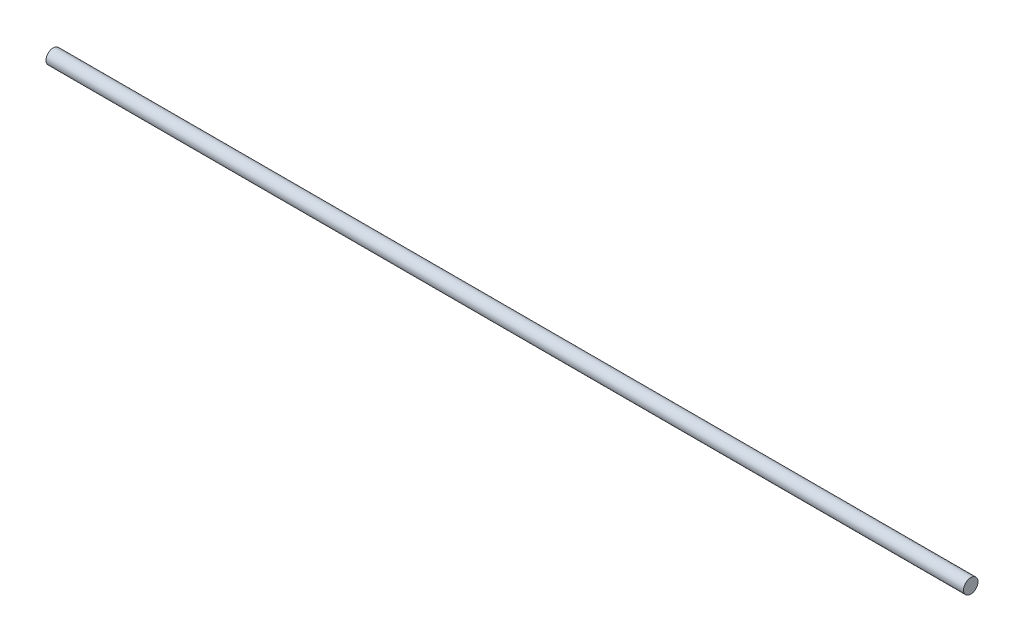
ISO-10303-21;
HEADER;
FILE_DESCRIPTION(('STEP AP214'),'2;1');
FILE_NAME('part.step','',(''),(''),'','','');
FILE_SCHEMA(('AUTOMOTIVE_DESIGN { 1 0 10303 214 1 1 1 1 }'));
ENDSEC;
DATA;
#1=APPLICATION_CONTEXT('core data for automotive mechanical design processes');
#2=APPLICATION_PROTOCOL_DEFINITION('international standard','automotive_design',2000,#1);
#3=PRODUCT_CONTEXT('',#1,'mechanical');
#4=PRODUCT('Part','Part','',(#3));
#5=PRODUCT_RELATED_PRODUCT_CATEGORY('part','',(#4));
#6=PRODUCT_DEFINITION_FORMATION('','',#4);
#7=PRODUCT_DEFINITION_CONTEXT('part definition',#1,'design');
#8=PRODUCT_DEFINITION('design','',#6,#7);
#9=PRODUCT_DEFINITION_SHAPE('','',#8);
#10=(LENGTH_UNIT() NAMED_UNIT(*) SI_UNIT(.MILLI.,.METRE.));
#11=(NAMED_UNIT(*) PLANE_ANGLE_UNIT() SI_UNIT($,.RADIAN.));
#12=(NAMED_UNIT(*) SI_UNIT($,.STERADIAN.) SOLID_ANGLE_UNIT());
#13=UNCERTAINTY_MEASURE_WITH_UNIT(LENGTH_MEASURE(1.E-05),#10,'distance_accuracy_value','');
#14=(GEOMETRIC_REPRESENTATION_CONTEXT(3) GLOBAL_UNCERTAINTY_ASSIGNED_CONTEXT((#13)) GLOBAL_UNIT_ASSIGNED_CONTEXT((#10,
#11,#12)) REPRESENTATION_CONTEXT('',''));
#15=CARTESIAN_POINT('',(0.,0.,0.));
#16=DIRECTION('',(0.,0.,1.));
#17=DIRECTION('',(1.,0.,0.));
#18=AXIS2_PLACEMENT_3D('',#15,#16,#17);
#19=CARTESIAN_POINT('',(158.765,0.,0.));
#20=DIRECTION('',(-1.,0.,0.));
#21=DIRECTION('',(0.,0.,1.));
#22=AXIS2_PLACEMENT_3D('',#19,#20,#21);
#23=CYLINDRICAL_SURFACE('',#22,2.5);
#24=CARTESIAN_POINT('',(158.765,0.,0.));
#25=DIRECTION('',(1.,0.,0.));
#26=DIRECTION('',(0.,0.,-1.));
#27=AXIS2_PLACEMENT_3D('',#24,#25,#26);
#28=CIRCLE('',#27,2.5);
#29=CARTESIAN_POINT('',(158.765,0.,-2.5));
#30=VERTEX_POINT('',#29);
#31=EDGE_CURVE('E10',#30,#30,#28,.T.);
#32=ORIENTED_EDGE('',*,*,#31,.F.);
#33=EDGE_LOOP('',(#32));
#34=FACE_BOUND('',#33,.T.);
#35=CARTESIAN_POINT('',(-158.765,0.,0.));
#36=DIRECTION('',(1.,0.,0.));
#37=DIRECTION('',(0.,0.,-1.));
#38=AXIS2_PLACEMENT_3D('',#35,#36,#37);
#39=CIRCLE('',#38,2.5);
#40=CARTESIAN_POINT('',(-158.765,0.,-2.5));
#41=VERTEX_POINT('',#40);
#42=EDGE_CURVE('E46',#41,#41,#39,.T.);
#43=ORIENTED_EDGE('',*,*,#42,.T.);
#44=EDGE_LOOP('',(#43));
#45=FACE_BOUND('',#44,.T.);
#46=ADVANCED_FACE('F43',(#34,#45),#23,.T.);
#47=CARTESIAN_POINT('',(158.765,0.,0.));
#48=DIRECTION('',(1.,0.,0.));
#49=DIRECTION('',(0.,0.,-1.));
#50=AXIS2_PLACEMENT_3D('',#47,#48,#49);
#51=PLANE('',#50);
#52=ORIENTED_EDGE('',*,*,#31,.T.);
#53=EDGE_LOOP('',(#52));
#54=FACE_BOUND('',#53,.T.);
#55=ADVANCED_FACE('F60',(#54),#51,.T.);
#56=CARTESIAN_POINT('',(-158.765,0.,0.));
#57=DIRECTION('',(1.,0.,0.));
#58=DIRECTION('',(0.,0.,-1.));
#59=AXIS2_PLACEMENT_3D('',#56,#57,#58);
#60=PLANE('',#59);
#61=ORIENTED_EDGE('',*,*,#42,.F.);
#62=EDGE_LOOP('',(#61));
#63=FACE_BOUND('',#62,.T.);
#64=ADVANCED_FACE('F58',(#63),#60,.F.);
#65=CLOSED_SHELL('',(#46,#55,#64));
#66=MANIFOLD_SOLID_BREP('B2',#65);
#67=ADVANCED_BREP_SHAPE_REPRESENTATION('',(#18,#66),#14);
#68=SHAPE_DEFINITION_REPRESENTATION(#9,#67);
ENDSEC;
END-ISO-10303-21;
